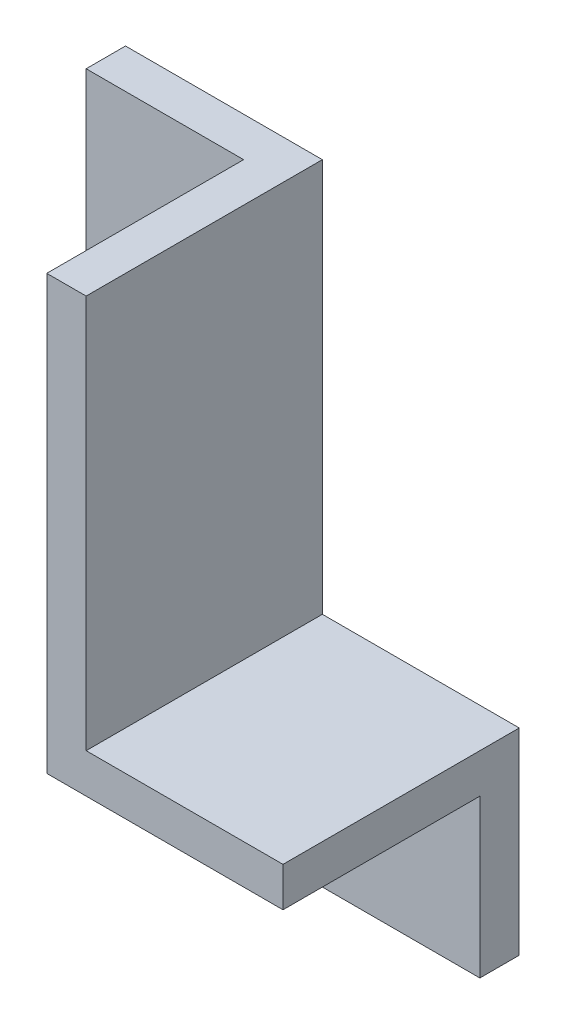
ISO-10303-21;
HEADER;
FILE_DESCRIPTION(('STEP AP214'),'2;1');
FILE_NAME('part.step','',(''),(''),'','','');
FILE_SCHEMA(('AUTOMOTIVE_DESIGN { 1 0 10303 214 1 1 1 1 }'));
ENDSEC;
DATA;
#1=APPLICATION_CONTEXT('core data for automotive mechanical design processes');
#2=APPLICATION_PROTOCOL_DEFINITION('international standard','automotive_design',2000,#1);
#3=PRODUCT_CONTEXT('',#1,'mechanical');
#4=PRODUCT('Part','Part','',(#3));
#5=PRODUCT_RELATED_PRODUCT_CATEGORY('part','',(#4));
#6=PRODUCT_DEFINITION_FORMATION('','',#4);
#7=PRODUCT_DEFINITION_CONTEXT('part definition',#1,'design');
#8=PRODUCT_DEFINITION('design','',#6,#7);
#9=PRODUCT_DEFINITION_SHAPE('','',#8);
#10=(LENGTH_UNIT() NAMED_UNIT(*) SI_UNIT(.MILLI.,.METRE.));
#11=(NAMED_UNIT(*) PLANE_ANGLE_UNIT() SI_UNIT($,.RADIAN.));
#12=(NAMED_UNIT(*) SI_UNIT($,.STERADIAN.) SOLID_ANGLE_UNIT());
#13=UNCERTAINTY_MEASURE_WITH_UNIT(LENGTH_MEASURE(1.E-05),#10,'distance_accuracy_value','');
#14=(GEOMETRIC_REPRESENTATION_CONTEXT(3) GLOBAL_UNCERTAINTY_ASSIGNED_CONTEXT((#13)) GLOBAL_UNIT_ASSIGNED_CONTEXT((#10,
#11,#12)) REPRESENTATION_CONTEXT('',''));
#15=CARTESIAN_POINT('',(0.,0.,0.));
#16=DIRECTION('',(0.,0.,1.));
#17=DIRECTION('',(1.,0.,0.));
#18=AXIS2_PLACEMENT_3D('',#15,#16,#17);
#19=CARTESIAN_POINT('',(0.,0.,10.));
#20=DIRECTION('',(0.,0.,-1.));
#21=DIRECTION('',(-1.,0.,0.));
#22=AXIS2_PLACEMENT_3D('',#19,#20,#21);
#23=PLANE('',#22);
#24=DIRECTION('',(1.,0.,0.));
#25=VECTOR('',#24,1.);
#26=CARTESIAN_POINT('',(40.,40.,10.));
#27=LINE('',#26,#25);
#28=CARTESIAN_POINT('',(40.,40.,10.));
#29=VERTEX_POINT('',#28);
#30=CARTESIAN_POINT('',(100.,40.,10.));
#31=VERTEX_POINT('',#30);
#32=EDGE_CURVE('E125',#29,#31,#27,.T.);
#33=ORIENTED_EDGE('',*,*,#32,.F.);
#34=DIRECTION('',(0.,-1.,0.));
#35=VECTOR('',#34,1.);
#36=CARTESIAN_POINT('',(40.,150.,10.));
#37=LINE('',#36,#35);
#38=CARTESIAN_POINT('',(40.,150.,10.));
#39=VERTEX_POINT('',#38);
#40=EDGE_CURVE('E50',#39,#29,#37,.T.);
#41=ORIENTED_EDGE('',*,*,#40,.F.);
#42=DIRECTION('',(-1.,0.,0.));
#43=VECTOR('',#42,1.);
#44=CARTESIAN_POINT('',(0.,150.,10.));
#45=LINE('',#44,#43);
#46=CARTESIAN_POINT('',(0.,150.,10.));
#47=VERTEX_POINT('',#46);
#48=EDGE_CURVE('E129',#39,#47,#45,.T.);
#49=ORIENTED_EDGE('',*,*,#48,.T.);
#50=DIRECTION('',(0.,-1.,0.));
#51=VECTOR('',#50,1.);
#52=CARTESIAN_POINT('',(0.,0.,10.));
#53=LINE('',#52,#51);
#54=CARTESIAN_POINT('',(0.,0.,10.));
#55=VERTEX_POINT('',#54);
#56=EDGE_CURVE('E148',#47,#55,#53,.T.);
#57=ORIENTED_EDGE('',*,*,#56,.T.);
#58=DIRECTION('',(1.,0.,0.));
#59=VECTOR('',#58,1.);
#60=CARTESIAN_POINT('',(0.,0.,10.));
#61=LINE('',#60,#59);
#62=CARTESIAN_POINT('',(100.,0.,10.));
#63=VERTEX_POINT('',#62);
#64=EDGE_CURVE('E151',#55,#63,#61,.T.);
#65=ORIENTED_EDGE('',*,*,#64,.T.);
#66=DIRECTION('',(0.,1.,0.));
#67=VECTOR('',#66,1.);
#68=CARTESIAN_POINT('',(100.,50.,10.));
#69=LINE('',#68,#67);
#70=EDGE_CURVE('E56',#63,#31,#69,.T.);
#71=ORIENTED_EDGE('',*,*,#70,.T.);
#72=EDGE_LOOP('',(#33,#41,#49,#57,#65,#71));
#73=FACE_BOUND('',#72,.T.);
#74=ADVANCED_FACE('F33',(#73),#23,.F.);
#75=CARTESIAN_POINT('',(0.,0.,10.));
#76=DIRECTION('',(1.,0.,0.));
#77=DIRECTION('',(0.,0.,-1.));
#78=AXIS2_PLACEMENT_3D('',#75,#76,#77);
#79=PLANE('',#78);
#80=DIRECTION('',(0.,-1.,0.));
#81=VECTOR('',#80,1.);
#82=CARTESIAN_POINT('',(0.,0.,0.));
#83=LINE('',#82,#81);
#84=CARTESIAN_POINT('',(0.,150.,0.));
#85=VERTEX_POINT('',#84);
#86=CARTESIAN_POINT('',(0.,0.,0.));
#87=VERTEX_POINT('',#86);
#88=EDGE_CURVE('E130',#85,#87,#83,.T.);
#89=ORIENTED_EDGE('',*,*,#88,.T.);
#90=DIRECTION('',(0.,0.,-1.));
#91=VECTOR('',#90,1.);
#92=CARTESIAN_POINT('',(0.,0.,10.));
#93=LINE('',#92,#91);
#94=EDGE_CURVE('E11',#55,#87,#93,.T.);
#95=ORIENTED_EDGE('',*,*,#94,.F.);
#96=ORIENTED_EDGE('',*,*,#56,.F.);
#97=DIRECTION('',(0.,0.,-1.));
#98=VECTOR('',#97,1.);
#99=CARTESIAN_POINT('',(0.,150.,10.));
#100=LINE('',#99,#98);
#101=EDGE_CURVE('E160',#47,#85,#100,.T.);
#102=ORIENTED_EDGE('',*,*,#101,.T.);
#103=EDGE_LOOP('',(#89,#95,#96,#102));
#104=FACE_BOUND('',#103,.T.);
#105=ADVANCED_FACE('F35',(#104),#79,.F.);
#106=CARTESIAN_POINT('',(0.,0.,10.));
#107=DIRECTION('',(0.,1.,0.));
#108=DIRECTION('',(0.,0.,1.));
#109=AXIS2_PLACEMENT_3D('',#106,#107,#108);
#110=PLANE('',#109);
#111=DIRECTION('',(1.,0.,0.));
#112=VECTOR('',#111,1.);
#113=CARTESIAN_POINT('',(0.,0.,0.));
#114=LINE('',#113,#112);
#115=CARTESIAN_POINT('',(100.,0.,0.));
#116=VERTEX_POINT('',#115);
#117=EDGE_CURVE('E133',#87,#116,#114,.T.);
#118=ORIENTED_EDGE('',*,*,#117,.T.);
#119=DIRECTION('',(0.,0.,-1.));
#120=VECTOR('',#119,1.);
#121=CARTESIAN_POINT('',(100.,0.,10.));
#122=LINE('',#121,#120);
#123=EDGE_CURVE('E42',#63,#116,#122,.T.);
#124=ORIENTED_EDGE('',*,*,#123,.F.);
#125=ORIENTED_EDGE('',*,*,#64,.F.);
#126=ORIENTED_EDGE('',*,*,#94,.T.);
#127=EDGE_LOOP('',(#118,#124,#125,#126));
#128=FACE_BOUND('',#127,.T.);
#129=ADVANCED_FACE('F222',(#128),#110,.F.);
#130=CARTESIAN_POINT('',(100.,50.,10.));
#131=DIRECTION('',(-1.,0.,0.));
#132=DIRECTION('',(0.,0.,1.));
#133=AXIS2_PLACEMENT_3D('',#130,#131,#132);
#134=PLANE('',#133);
#135=DIRECTION('',(0.,1.,0.));
#136=VECTOR('',#135,1.);
#137=CARTESIAN_POINT('',(100.,50.,0.));
#138=LINE('',#137,#136);
#139=CARTESIAN_POINT('',(100.,50.,0.));
#140=VERTEX_POINT('',#139);
#141=EDGE_CURVE('E192',#116,#140,#138,.T.);
#142=ORIENTED_EDGE('',*,*,#141,.T.);
#143=DIRECTION('',(0.,0.,-1.));
#144=VECTOR('',#143,1.);
#145=CARTESIAN_POINT('',(100.,50.,10.));
#146=LINE('',#145,#144);
#147=CARTESIAN_POINT('',(100.,50.,60.));
#148=VERTEX_POINT('',#147);
#149=EDGE_CURVE('E176',#148,#140,#146,.T.);
#150=ORIENTED_EDGE('',*,*,#149,.F.);
#151=DIRECTION('',(0.,1.,0.));
#152=VECTOR('',#151,1.);
#153=CARTESIAN_POINT('',(100.,40.,60.));
#154=LINE('',#153,#152);
#155=CARTESIAN_POINT('',(100.,40.,60.));
#156=VERTEX_POINT('',#155);
#157=EDGE_CURVE('E167',#156,#148,#154,.T.);
#158=ORIENTED_EDGE('',*,*,#157,.F.);
#159=DIRECTION('',(0.,0.,-1.));
#160=VECTOR('',#159,1.);
#161=CARTESIAN_POINT('',(100.,40.,60.));
#162=LINE('',#161,#160);
#163=EDGE_CURVE('E135',#156,#31,#162,.T.);
#164=ORIENTED_EDGE('',*,*,#163,.T.);
#165=ORIENTED_EDGE('',*,*,#70,.F.);
#166=ORIENTED_EDGE('',*,*,#123,.T.);
#167=EDGE_LOOP('',(#142,#150,#158,#164,#165,#166));
#168=FACE_BOUND('',#167,.T.);
#169=ADVANCED_FACE('F173',(#168),#134,.F.);
#170=CARTESIAN_POINT('',(50.,50.,10.));
#171=DIRECTION('',(0.,-1.,0.));
#172=DIRECTION('',(0.,0.,-1.));
#173=AXIS2_PLACEMENT_3D('',#170,#171,#172);
#174=PLANE('',#173);
#175=DIRECTION('',(-1.,0.,0.));
#176=VECTOR('',#175,1.);
#177=CARTESIAN_POINT('',(50.,50.,0.));
#178=LINE('',#177,#176);
#179=CARTESIAN_POINT('',(50.,50.,0.));
#180=VERTEX_POINT('',#179);
#181=EDGE_CURVE('E182',#140,#180,#178,.T.);
#182=ORIENTED_EDGE('',*,*,#181,.T.);
#183=DIRECTION('',(0.,0.,-1.));
#184=VECTOR('',#183,1.);
#185=CARTESIAN_POINT('',(50.,50.,10.));
#186=LINE('',#185,#184);
#187=CARTESIAN_POINT('',(50.,50.,60.));
#188=VERTEX_POINT('',#187);
#189=EDGE_CURVE('E181',#188,#180,#186,.T.);
#190=ORIENTED_EDGE('',*,*,#189,.F.);
#191=DIRECTION('',(-1.,0.,0.));
#192=VECTOR('',#191,1.);
#193=CARTESIAN_POINT('',(100.,50.,60.));
#194=LINE('',#193,#192);
#195=EDGE_CURVE('E169',#148,#188,#194,.T.);
#196=ORIENTED_EDGE('',*,*,#195,.F.);
#197=ORIENTED_EDGE('',*,*,#149,.T.);
#198=EDGE_LOOP('',(#182,#190,#196,#197));
#199=FACE_BOUND('',#198,.T.);
#200=ADVANCED_FACE('F178',(#199),#174,.F.);
#201=CARTESIAN_POINT('',(50.,150.,10.));
#202=DIRECTION('',(-1.,0.,0.));
#203=DIRECTION('',(0.,0.,1.));
#204=AXIS2_PLACEMENT_3D('',#201,#202,#203);
#205=PLANE('',#204);
#206=DIRECTION('',(0.,1.,0.));
#207=VECTOR('',#206,1.);
#208=CARTESIAN_POINT('',(50.,150.,0.));
#209=LINE('',#208,#207);
#210=CARTESIAN_POINT('',(50.,150.,0.));
#211=VERTEX_POINT('',#210);
#212=EDGE_CURVE('E198',#180,#211,#209,.T.);
#213=ORIENTED_EDGE('',*,*,#212,.T.);
#214=DIRECTION('',(0.,0.,-1.));
#215=VECTOR('',#214,1.);
#216=CARTESIAN_POINT('',(50.,150.,10.));
#217=LINE('',#216,#215);
#218=CARTESIAN_POINT('',(50.,150.,60.));
#219=VERTEX_POINT('',#218);
#220=EDGE_CURVE('E185',#219,#211,#217,.T.);
#221=ORIENTED_EDGE('',*,*,#220,.F.);
#222=DIRECTION('',(0.,1.,0.));
#223=VECTOR('',#222,1.);
#224=CARTESIAN_POINT('',(50.,50.,60.));
#225=LINE('',#224,#223);
#226=EDGE_CURVE('E122',#188,#219,#225,.T.);
#227=ORIENTED_EDGE('',*,*,#226,.F.);
#228=ORIENTED_EDGE('',*,*,#189,.T.);
#229=EDGE_LOOP('',(#213,#221,#227,#228));
#230=FACE_BOUND('',#229,.T.);
#231=ADVANCED_FACE('F208',(#230),#205,.F.);
#232=CARTESIAN_POINT('',(0.,150.,10.));
#233=DIRECTION('',(0.,-1.,0.));
#234=DIRECTION('',(0.,0.,-1.));
#235=AXIS2_PLACEMENT_3D('',#232,#233,#234);
#236=PLANE('',#235);
#237=DIRECTION('',(-1.,0.,0.));
#238=VECTOR('',#237,1.);
#239=CARTESIAN_POINT('',(0.,150.,0.));
#240=LINE('',#239,#238);
#241=EDGE_CURVE('E152',#211,#85,#240,.T.);
#242=ORIENTED_EDGE('',*,*,#241,.T.);
#243=ORIENTED_EDGE('',*,*,#101,.F.);
#244=ORIENTED_EDGE('',*,*,#48,.F.);
#245=DIRECTION('',(0.,0.,-1.));
#246=VECTOR('',#245,1.);
#247=CARTESIAN_POINT('',(40.,150.,60.));
#248=LINE('',#247,#246);
#249=CARTESIAN_POINT('',(40.,150.,60.));
#250=VERTEX_POINT('',#249);
#251=EDGE_CURVE('E109',#250,#39,#248,.T.);
#252=ORIENTED_EDGE('',*,*,#251,.F.);
#253=DIRECTION('',(-1.,0.,0.));
#254=VECTOR('',#253,1.);
#255=CARTESIAN_POINT('',(50.,150.,60.));
#256=LINE('',#255,#254);
#257=EDGE_CURVE('E115',#219,#250,#256,.T.);
#258=ORIENTED_EDGE('',*,*,#257,.F.);
#259=ORIENTED_EDGE('',*,*,#220,.T.);
#260=EDGE_LOOP('',(#242,#243,#244,#252,#258,#259));
#261=FACE_BOUND('',#260,.T.);
#262=ADVANCED_FACE('F127',(#261),#236,.F.);
#263=CARTESIAN_POINT('',(0.,0.,0.));
#264=DIRECTION('',(0.,0.,-1.));
#265=DIRECTION('',(-1.,0.,0.));
#266=AXIS2_PLACEMENT_3D('',#263,#264,#265);
#267=PLANE('',#266);
#268=ORIENTED_EDGE('',*,*,#88,.F.);
#269=ORIENTED_EDGE('',*,*,#241,.F.);
#270=ORIENTED_EDGE('',*,*,#212,.F.);
#271=ORIENTED_EDGE('',*,*,#181,.F.);
#272=ORIENTED_EDGE('',*,*,#141,.F.);
#273=ORIENTED_EDGE('',*,*,#117,.F.);
#274=EDGE_LOOP('',(#268,#269,#270,#271,#272,#273));
#275=FACE_BOUND('',#274,.T.);
#276=ADVANCED_FACE('F196',(#275),#267,.T.);
#277=CARTESIAN_POINT('',(40.,150.,60.));
#278=DIRECTION('',(1.,0.,0.));
#279=DIRECTION('',(0.,1.,0.));
#280=AXIS2_PLACEMENT_3D('',#277,#278,#279);
#281=PLANE('',#280);
#282=ORIENTED_EDGE('',*,*,#40,.T.);
#283=DIRECTION('',(0.,0.,-1.));
#284=VECTOR('',#283,1.);
#285=CARTESIAN_POINT('',(40.,40.,60.));
#286=LINE('',#285,#284);
#287=CARTESIAN_POINT('',(40.,40.,60.));
#288=VERTEX_POINT('',#287);
#289=EDGE_CURVE('E111',#288,#29,#286,.T.);
#290=ORIENTED_EDGE('',*,*,#289,.F.);
#291=DIRECTION('',(0.,-1.,0.));
#292=VECTOR('',#291,1.);
#293=CARTESIAN_POINT('',(40.,150.,60.));
#294=LINE('',#293,#292);
#295=EDGE_CURVE('E105',#250,#288,#294,.T.);
#296=ORIENTED_EDGE('',*,*,#295,.F.);
#297=ORIENTED_EDGE('',*,*,#251,.T.);
#298=EDGE_LOOP('',(#282,#290,#296,#297));
#299=FACE_BOUND('',#298,.T.);
#300=ADVANCED_FACE('F107',(#299),#281,.F.);
#301=CARTESIAN_POINT('',(40.,40.,60.));
#302=DIRECTION('',(0.,1.,0.));
#303=DIRECTION('',(0.,0.,1.));
#304=AXIS2_PLACEMENT_3D('',#301,#302,#303);
#305=PLANE('',#304);
#306=ORIENTED_EDGE('',*,*,#32,.T.);
#307=ORIENTED_EDGE('',*,*,#163,.F.);
#308=DIRECTION('',(1.,0.,0.));
#309=VECTOR('',#308,1.);
#310=CARTESIAN_POINT('',(40.,40.,60.));
#311=LINE('',#310,#309);
#312=EDGE_CURVE('E114',#288,#156,#311,.T.);
#313=ORIENTED_EDGE('',*,*,#312,.F.);
#314=ORIENTED_EDGE('',*,*,#289,.T.);
#315=EDGE_LOOP('',(#306,#307,#313,#314));
#316=FACE_BOUND('',#315,.T.);
#317=ADVANCED_FACE('F162',(#316),#305,.F.);
#318=CARTESIAN_POINT('',(0.,0.,60.));
#319=DIRECTION('',(0.,0.,1.));
#320=DIRECTION('',(1.,0.,0.));
#321=AXIS2_PLACEMENT_3D('',#318,#319,#320);
#322=PLANE('',#321);
#323=ORIENTED_EDGE('',*,*,#257,.T.);
#324=ORIENTED_EDGE('',*,*,#295,.T.);
#325=ORIENTED_EDGE('',*,*,#312,.T.);
#326=ORIENTED_EDGE('',*,*,#157,.T.);
#327=ORIENTED_EDGE('',*,*,#195,.T.);
#328=ORIENTED_EDGE('',*,*,#226,.T.);
#329=EDGE_LOOP('',(#323,#324,#325,#326,#327,#328));
#330=FACE_BOUND('',#329,.T.);
#331=ADVANCED_FACE('F119',(#330),#322,.T.);
#332=CLOSED_SHELL('',(#74,#105,#129,#169,#200,#231,#262,#276,#300,#317,#331));
#333=MANIFOLD_SOLID_BREP('B2',#332);
#334=ADVANCED_BREP_SHAPE_REPRESENTATION('',(#18,#333),#14);
#335=SHAPE_DEFINITION_REPRESENTATION(#9,#334);
ENDSEC;
END-ISO-10303-21;
